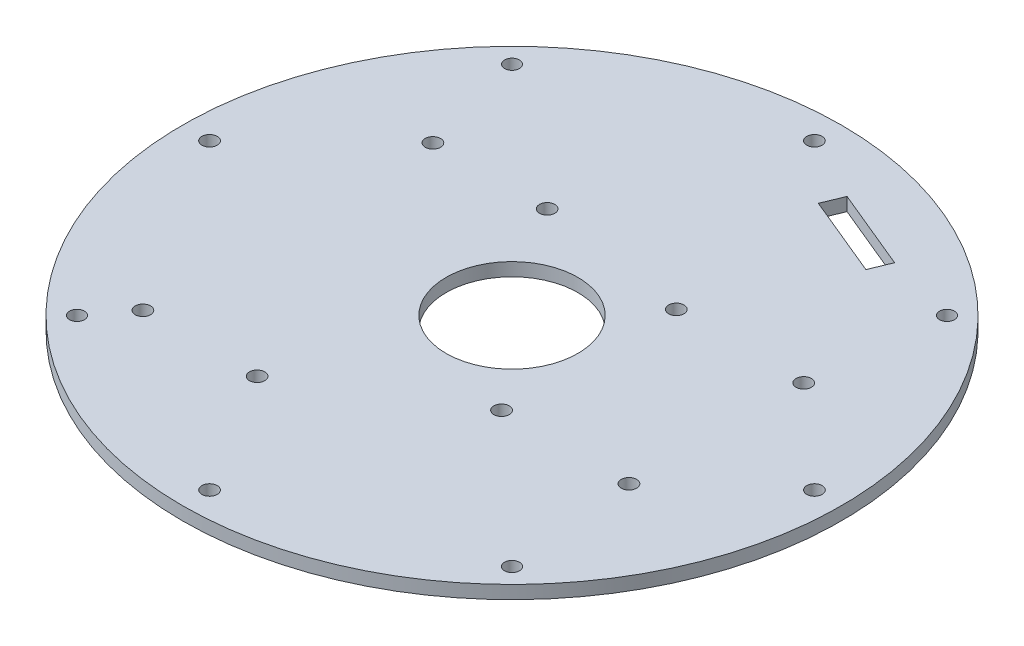
ISO-10303-21;
HEADER;
FILE_DESCRIPTION(('STEP AP214'),'2;1');
FILE_NAME('part.step','',(''),(''),'','','');
FILE_SCHEMA(('AUTOMOTIVE_DESIGN { 1 0 10303 214 1 1 1 1 }'));
ENDSEC;
DATA;
#1=APPLICATION_CONTEXT('core data for automotive mechanical design processes');
#2=APPLICATION_PROTOCOL_DEFINITION('international standard','automotive_design',2000,#1);
#3=PRODUCT_CONTEXT('',#1,'mechanical');
#4=PRODUCT('Part','Part','',(#3));
#5=PRODUCT_RELATED_PRODUCT_CATEGORY('part','',(#4));
#6=PRODUCT_DEFINITION_FORMATION('','',#4);
#7=PRODUCT_DEFINITION_CONTEXT('part definition',#1,'design');
#8=PRODUCT_DEFINITION('design','',#6,#7);
#9=PRODUCT_DEFINITION_SHAPE('','',#8);
#10=(LENGTH_UNIT() NAMED_UNIT(*) SI_UNIT(.MILLI.,.METRE.));
#11=(NAMED_UNIT(*) PLANE_ANGLE_UNIT() SI_UNIT($,.RADIAN.));
#12=(NAMED_UNIT(*) SI_UNIT($,.STERADIAN.) SOLID_ANGLE_UNIT());
#13=UNCERTAINTY_MEASURE_WITH_UNIT(LENGTH_MEASURE(1.E-05),#10,'distance_accuracy_value','');
#14=(GEOMETRIC_REPRESENTATION_CONTEXT(3) GLOBAL_UNCERTAINTY_ASSIGNED_CONTEXT((#13)) GLOBAL_UNIT_ASSIGNED_CONTEXT((#10,
#11,#12)) REPRESENTATION_CONTEXT('',''));
#15=CARTESIAN_POINT('',(0.,0.,0.));
#16=DIRECTION('',(0.,0.,1.));
#17=DIRECTION('',(1.,0.,0.));
#18=AXIS2_PLACEMENT_3D('',#15,#16,#17);
#19=CARTESIAN_POINT('',(0.,3.,0.));
#20=DIRECTION('',(0.,1.,0.));
#21=DIRECTION('',(0.,0.,1.));
#22=AXIS2_PLACEMENT_3D('',#19,#20,#21);
#23=PLANE('',#22);
#24=CARTESIAN_POINT('',(46.4944426533332,3.,19.8841311409812));
#25=DIRECTION('',(0.,1.,0.));
#26=DIRECTION('',(0.,0.,1.));
#27=AXIS2_PLACEMENT_3D('',#24,#25,#26);
#28=CIRCLE('',#27,1.75);
#29=CARTESIAN_POINT('',(46.4944426533332,3.,21.6341311409812));
#30=VERTEX_POINT('',#29);
#31=EDGE_CURVE('E133',#30,#30,#28,.T.);
#32=ORIENTED_EDGE('',*,*,#31,.F.);
#33=EDGE_LOOP('',(#32));
#34=FACE_BOUND('',#33,.T.);
#35=CARTESIAN_POINT('',(-43.,3.,41.));
#36=DIRECTION('',(0.,1.,0.));
#37=DIRECTION('',(0.,0.,1.));
#38=AXIS2_PLACEMENT_3D('',#35,#36,#37);
#39=CIRCLE('',#38,1.75);
#40=CARTESIAN_POINT('',(-43.,3.,42.75));
#41=VERTEX_POINT('',#40);
#42=EDGE_CURVE('E126',#41,#41,#39,.T.);
#43=ORIENTED_EDGE('',*,*,#42,.F.);
#44=EDGE_LOOP('',(#43));
#45=FACE_BOUND('',#44,.T.);
#46=CARTESIAN_POINT('',(-17.,3.,41.));
#47=DIRECTION('',(0.,1.,0.));
#48=DIRECTION('',(0.,0.,1.));
#49=AXIS2_PLACEMENT_3D('',#46,#47,#48);
#50=CIRCLE('',#49,1.75);
#51=CARTESIAN_POINT('',(-17.,3.,42.75));
#52=VERTEX_POINT('',#51);
#53=EDGE_CURVE('E145',#52,#52,#50,.T.);
#54=ORIENTED_EDGE('',*,*,#53,.F.);
#55=EDGE_LOOP('',(#54));
#56=FACE_BOUND('',#55,.T.);
#57=CARTESIAN_POINT('',(-17.,3.,-25.));
#58=DIRECTION('',(0.,1.,0.));
#59=DIRECTION('',(0.,0.,1.));
#60=AXIS2_PLACEMENT_3D('',#57,#58,#59);
#61=CIRCLE('',#60,1.75);
#62=CARTESIAN_POINT('',(-17.,3.,-23.25));
#63=VERTEX_POINT('',#62);
#64=EDGE_CURVE('E138',#63,#63,#61,.T.);
#65=ORIENTED_EDGE('',*,*,#64,.F.);
#66=EDGE_LOOP('',(#65));
#67=FACE_BOUND('',#66,.T.);
#68=DIRECTION('',(-0.923879532511288,0.,-0.382683432365086));
#69=VECTOR('',#68,1.);
#70=CARTESIAN_POINT('',(33.1565098479308,3.,-53.9156364583046));
#71=LINE('',#70,#69);
#72=CARTESIAN_POINT('',(33.1565098479308,3.,-53.9156364583046));
#73=VERTEX_POINT('',#72);
#74=CARTESIAN_POINT('',(14.678919197705,3.,-61.5693051056064));
#75=VERTEX_POINT('',#74);
#76=EDGE_CURVE('E82',#73,#75,#71,.T.);
#77=ORIENTED_EDGE('',*,*,#76,.F.);
#78=DIRECTION('',(0.382683432365087,0.,-0.923879532511288));
#79=VECTOR('',#78,1.);
#80=CARTESIAN_POINT('',(31.2430926861054,3.,-49.2962387957482));
#81=LINE('',#80,#79);
#82=CARTESIAN_POINT('',(31.2430926861054,3.,-49.2962387957482));
#83=VERTEX_POINT('',#82);
#84=EDGE_CURVE('E74',#83,#73,#81,.T.);
#85=ORIENTED_EDGE('',*,*,#84,.F.);
#86=DIRECTION('',(0.923879532511288,0.,0.382683432365086));
#87=VECTOR('',#86,1.);
#88=CARTESIAN_POINT('',(31.2430926861054,3.,-49.2962387957482));
#89=LINE('',#88,#87);
#90=CARTESIAN_POINT('',(12.7655020358796,3.,-56.9499074430499));
#91=VERTEX_POINT('',#90);
#92=EDGE_CURVE('E97',#91,#83,#89,.T.);
#93=ORIENTED_EDGE('',*,*,#92,.F.);
#94=DIRECTION('',(-0.382683432365086,0.,0.923879532511288));
#95=VECTOR('',#94,1.);
#96=CARTESIAN_POINT('',(12.7655020358796,3.,-56.9499074430499));
#97=LINE('',#96,#95);
#98=EDGE_CURVE('E95',#75,#91,#97,.T.);
#99=ORIENTED_EDGE('',*,*,#98,.F.);
#100=EDGE_LOOP('',(#77,#85,#93,#99));
#101=FACE_BOUND('',#100,.T.);
#102=CARTESIAN_POINT('',(17.5055573466668,3.,19.8841311409812));
#103=DIRECTION('',(0.,1.,0.));
#104=DIRECTION('',(0.,0.,1.));
#105=AXIS2_PLACEMENT_3D('',#102,#103,#104);
#106=CIRCLE('',#105,1.75);
#107=CARTESIAN_POINT('',(17.5055573466668,3.,21.6341311409812));
#108=VERTEX_POINT('',#107);
#109=EDGE_CURVE('E125',#108,#108,#106,.T.);
#110=ORIENTED_EDGE('',*,*,#109,.F.);
#111=EDGE_LOOP('',(#110));
#112=FACE_BOUND('',#111,.T.);
#113=CARTESIAN_POINT('',(46.4944426533332,3.,-19.8841311409812));
#114=DIRECTION('',(0.,1.,0.));
#115=DIRECTION('',(0.,0.,1.));
#116=AXIS2_PLACEMENT_3D('',#113,#114,#115);
#117=CIRCLE('',#116,1.75);
#118=CARTESIAN_POINT('',(46.4944426533332,3.,-18.1341311409812));
#119=VERTEX_POINT('',#118);
#120=EDGE_CURVE('E119',#119,#119,#117,.T.);
#121=ORIENTED_EDGE('',*,*,#120,.F.);
#122=EDGE_LOOP('',(#121));
#123=FACE_BOUND('',#122,.T.);
#124=CARTESIAN_POINT('',(17.5055573466668,3.,-19.8841311409812));
#125=DIRECTION('',(0.,1.,0.));
#126=DIRECTION('',(0.,0.,1.));
#127=AXIS2_PLACEMENT_3D('',#124,#125,#126);
#128=CIRCLE('',#127,1.74999999999999);
#129=CARTESIAN_POINT('',(17.5055573466668,3.,-18.1341311409812));
#130=VERTEX_POINT('',#129);
#131=EDGE_CURVE('E112',#130,#130,#128,.T.);
#132=ORIENTED_EDGE('',*,*,#131,.F.);
#133=EDGE_LOOP('',(#132));
#134=FACE_BOUND('',#133,.T.);
#135=CARTESIAN_POINT('',(-43.,3.,-25.));
#136=DIRECTION('',(0.,1.,0.));
#137=DIRECTION('',(0.,0.,1.));
#138=AXIS2_PLACEMENT_3D('',#135,#136,#137);
#139=CIRCLE('',#138,1.75);
#140=CARTESIAN_POINT('',(-43.,3.,-23.25));
#141=VERTEX_POINT('',#140);
#142=EDGE_CURVE('E150',#141,#141,#139,.T.);
#143=ORIENTED_EDGE('',*,*,#142,.F.);
#144=EDGE_LOOP('',(#143));
#145=FACE_BOUND('',#144,.T.);
#146=CARTESIAN_POINT('',(0.,3.,-68.825));
#147=DIRECTION('',(0.,1.,0.));
#148=DIRECTION('',(0.,0.,1.));
#149=AXIS2_PLACEMENT_3D('',#146,#147,#148);
#150=CIRCLE('',#149,1.75);
#151=CARTESIAN_POINT('',(0.,3.,-67.075));
#152=VERTEX_POINT('',#151);
#153=EDGE_CURVE('E156',#152,#152,#150,.T.);
#154=ORIENTED_EDGE('',*,*,#153,.F.);
#155=EDGE_LOOP('',(#154));
#156=FACE_BOUND('',#155,.T.);
#157=CARTESIAN_POINT('',(68.825,3.,0.));
#158=DIRECTION('',(0.,1.,0.));
#159=DIRECTION('',(0.,0.,1.));
#160=AXIS2_PLACEMENT_3D('',#157,#158,#159);
#161=CIRCLE('',#160,1.75);
#162=CARTESIAN_POINT('',(68.825,3.,1.75));
#163=VERTEX_POINT('',#162);
#164=EDGE_CURVE('E163',#163,#163,#161,.T.);
#165=ORIENTED_EDGE('',*,*,#164,.F.);
#166=EDGE_LOOP('',(#165));
#167=FACE_BOUND('',#166,.T.);
#168=CARTESIAN_POINT('',(0.,3.,68.825));
#169=DIRECTION('',(0.,1.,0.));
#170=DIRECTION('',(0.,0.,1.));
#171=AXIS2_PLACEMENT_3D('',#168,#169,#170);
#172=CIRCLE('',#171,1.75);
#173=CARTESIAN_POINT('',(0.,3.,70.575));
#174=VERTEX_POINT('',#173);
#175=EDGE_CURVE('E169',#174,#174,#172,.T.);
#176=ORIENTED_EDGE('',*,*,#175,.F.);
#177=EDGE_LOOP('',(#176));
#178=FACE_BOUND('',#177,.T.);
#179=CARTESIAN_POINT('',(-68.825,3.,0.));
#180=DIRECTION('',(0.,1.,0.));
#181=DIRECTION('',(0.,0.,1.));
#182=AXIS2_PLACEMENT_3D('',#179,#180,#181);
#183=CIRCLE('',#182,1.75);
#184=CARTESIAN_POINT('',(-68.825,3.,1.75));
#185=VERTEX_POINT('',#184);
#186=EDGE_CURVE('E175',#185,#185,#183,.T.);
#187=ORIENTED_EDGE('',*,*,#186,.F.);
#188=EDGE_LOOP('',(#187));
#189=FACE_BOUND('',#188,.T.);
#190=CARTESIAN_POINT('',(49.4974746830584,3.,49.4974746830582));
#191=DIRECTION('',(0.,1.,0.));
#192=DIRECTION('',(0.,0.,1.));
#193=AXIS2_PLACEMENT_3D('',#190,#191,#192);
#194=CIRCLE('',#193,1.7);
#195=CARTESIAN_POINT('',(49.4974746830584,3.,51.1974746830582));
#196=VERTEX_POINT('',#195);
#197=EDGE_CURVE('E186',#196,#196,#194,.T.);
#198=ORIENTED_EDGE('',*,*,#197,.F.);
#199=EDGE_LOOP('',(#198));
#200=FACE_BOUND('',#199,.T.);
#201=CARTESIAN_POINT('',(-49.4974746830584,3.,-49.4974746830582));
#202=DIRECTION('',(0.,1.,0.));
#203=DIRECTION('',(0.,0.,1.));
#204=AXIS2_PLACEMENT_3D('',#201,#202,#203);
#205=CIRCLE('',#204,1.7);
#206=CARTESIAN_POINT('',(-49.4974746830584,3.,-47.7974746830582));
#207=VERTEX_POINT('',#206);
#208=EDGE_CURVE('E198',#207,#207,#205,.T.);
#209=ORIENTED_EDGE('',*,*,#208,.F.);
#210=EDGE_LOOP('',(#209));
#211=FACE_BOUND('',#210,.T.);
#212=CARTESIAN_POINT('',(0.,3.,0.));
#213=DIRECTION('',(0.,1.,0.));
#214=DIRECTION('',(0.,0.,1.));
#215=AXIS2_PLACEMENT_3D('',#212,#213,#214);
#216=CIRCLE('',#215,75.);
#217=CARTESIAN_POINT('',(0.,3.,75.));
#218=VERTEX_POINT('',#217);
#219=EDGE_CURVE('E11',#218,#218,#216,.T.);
#220=ORIENTED_EDGE('',*,*,#219,.T.);
#221=EDGE_LOOP('',(#220));
#222=FACE_BOUND('',#221,.T.);
#223=CARTESIAN_POINT('',(49.4974746830582,3.,-49.4974746830584));
#224=DIRECTION('',(0.,1.,0.));
#225=DIRECTION('',(0.,0.,1.));
#226=AXIS2_PLACEMENT_3D('',#223,#224,#225);
#227=CIRCLE('',#226,1.7);
#228=CARTESIAN_POINT('',(49.4974746830582,3.,-47.7974746830584));
#229=VERTEX_POINT('',#228);
#230=EDGE_CURVE('E204',#229,#229,#227,.T.);
#231=ORIENTED_EDGE('',*,*,#230,.F.);
#232=EDGE_LOOP('',(#231));
#233=FACE_BOUND('',#232,.T.);
#234=CARTESIAN_POINT('',(-49.4974746830582,3.,49.4974746830584));
#235=DIRECTION('',(0.,1.,0.));
#236=DIRECTION('',(0.,0.,1.));
#237=AXIS2_PLACEMENT_3D('',#234,#235,#236);
#238=CIRCLE('',#237,1.7);
#239=CARTESIAN_POINT('',(-49.4974746830582,3.,51.1974746830584));
#240=VERTEX_POINT('',#239);
#241=EDGE_CURVE('E192',#240,#240,#238,.T.);
#242=ORIENTED_EDGE('',*,*,#241,.F.);
#243=EDGE_LOOP('',(#242));
#244=FACE_BOUND('',#243,.T.);
#245=CARTESIAN_POINT('',(0.,3.,0.));
#246=DIRECTION('',(0.,1.,0.));
#247=DIRECTION('',(0.,0.,1.));
#248=AXIS2_PLACEMENT_3D('',#245,#246,#247);
#249=CIRCLE('',#248,15.);
#250=CARTESIAN_POINT('',(0.,3.,15.));
#251=VERTEX_POINT('',#250);
#252=EDGE_CURVE('E180',#251,#251,#249,.T.);
#253=ORIENTED_EDGE('',*,*,#252,.F.);
#254=EDGE_LOOP('',(#253));
#255=FACE_BOUND('',#254,.T.);
#256=ADVANCED_FACE('F33',(#34,#45,#56,#67,#101,#112,#123,#134,#145,#156,#167,#178,#189,#200,
#211,#222,#233,#244,#255),#23,.T.);
#257=CARTESIAN_POINT('',(0.,0.,0.));
#258=DIRECTION('',(0.,1.,0.));
#259=DIRECTION('',(0.,0.,1.));
#260=AXIS2_PLACEMENT_3D('',#257,#258,#259);
#261=PLANE('',#260);
#262=CARTESIAN_POINT('',(46.4944426533332,0.,19.8841311409812));
#263=DIRECTION('',(0.,1.,0.));
#264=DIRECTION('',(0.,0.,1.));
#265=AXIS2_PLACEMENT_3D('',#262,#263,#264);
#266=CIRCLE('',#265,1.75);
#267=CARTESIAN_POINT('',(46.4944426533332,0.,21.6341311409812));
#268=VERTEX_POINT('',#267);
#269=EDGE_CURVE('E115',#268,#268,#266,.T.);
#270=ORIENTED_EDGE('',*,*,#269,.T.);
#271=EDGE_LOOP('',(#270));
#272=FACE_BOUND('',#271,.T.);
#273=CARTESIAN_POINT('',(-43.,0.,41.));
#274=DIRECTION('',(0.,1.,0.));
#275=DIRECTION('',(0.,0.,1.));
#276=AXIS2_PLACEMENT_3D('',#273,#274,#275);
#277=CIRCLE('',#276,1.75);
#278=CARTESIAN_POINT('',(-43.,0.,42.75));
#279=VERTEX_POINT('',#278);
#280=EDGE_CURVE('E130',#279,#279,#277,.T.);
#281=ORIENTED_EDGE('',*,*,#280,.T.);
#282=EDGE_LOOP('',(#281));
#283=FACE_BOUND('',#282,.T.);
#284=CARTESIAN_POINT('',(-17.,0.,41.));
#285=DIRECTION('',(0.,1.,0.));
#286=DIRECTION('',(0.,0.,1.));
#287=AXIS2_PLACEMENT_3D('',#284,#285,#286);
#288=CIRCLE('',#287,1.75);
#289=CARTESIAN_POINT('',(-17.,0.,42.75));
#290=VERTEX_POINT('',#289);
#291=EDGE_CURVE('E129',#290,#290,#288,.T.);
#292=ORIENTED_EDGE('',*,*,#291,.T.);
#293=EDGE_LOOP('',(#292));
#294=FACE_BOUND('',#293,.T.);
#295=CARTESIAN_POINT('',(-17.,0.,-25.));
#296=DIRECTION('',(0.,1.,0.));
#297=DIRECTION('',(0.,0.,1.));
#298=AXIS2_PLACEMENT_3D('',#295,#296,#297);
#299=CIRCLE('',#298,1.75);
#300=CARTESIAN_POINT('',(-17.,0.,-23.25));
#301=VERTEX_POINT('',#300);
#302=EDGE_CURVE('E142',#301,#301,#299,.T.);
#303=ORIENTED_EDGE('',*,*,#302,.T.);
#304=EDGE_LOOP('',(#303));
#305=FACE_BOUND('',#304,.T.);
#306=DIRECTION('',(0.382683432365087,0.,-0.923879532511288));
#307=VECTOR('',#306,1.);
#308=CARTESIAN_POINT('',(31.2430926861054,0.,-49.2962387957482));
#309=LINE('',#308,#307);
#310=CARTESIAN_POINT('',(31.2430926861054,0.,-49.2962387957482));
#311=VERTEX_POINT('',#310);
#312=CARTESIAN_POINT('',(33.1565098479308,0.,-53.9156364583046));
#313=VERTEX_POINT('',#312);
#314=EDGE_CURVE('E56',#311,#313,#309,.T.);
#315=ORIENTED_EDGE('',*,*,#314,.T.);
#316=DIRECTION('',(-0.923879532511288,0.,-0.382683432365086));
#317=VECTOR('',#316,1.);
#318=CARTESIAN_POINT('',(33.1565098479308,0.,-53.9156364583046));
#319=LINE('',#318,#317);
#320=CARTESIAN_POINT('',(14.678919197705,0.,-61.5693051056064));
#321=VERTEX_POINT('',#320);
#322=EDGE_CURVE('E89',#313,#321,#319,.T.);
#323=ORIENTED_EDGE('',*,*,#322,.T.);
#324=DIRECTION('',(-0.382683432365086,0.,0.923879532511288));
#325=VECTOR('',#324,1.);
#326=CARTESIAN_POINT('',(12.7655020358796,0.,-56.9499074430499));
#327=LINE('',#326,#325);
#328=CARTESIAN_POINT('',(12.7655020358796,0.,-56.9499074430499));
#329=VERTEX_POINT('',#328);
#330=EDGE_CURVE('E104',#321,#329,#327,.T.);
#331=ORIENTED_EDGE('',*,*,#330,.T.);
#332=DIRECTION('',(0.923879532511288,0.,0.382683432365086));
#333=VECTOR('',#332,1.);
#334=CARTESIAN_POINT('',(31.2430926861054,0.,-49.2962387957482));
#335=LINE('',#334,#333);
#336=EDGE_CURVE('E83',#329,#311,#335,.T.);
#337=ORIENTED_EDGE('',*,*,#336,.T.);
#338=EDGE_LOOP('',(#315,#323,#331,#337));
#339=FACE_BOUND('',#338,.T.);
#340=CARTESIAN_POINT('',(17.5055573466668,0.,19.8841311409812));
#341=DIRECTION('',(0.,1.,0.));
#342=DIRECTION('',(0.,0.,1.));
#343=AXIS2_PLACEMENT_3D('',#340,#341,#342);
#344=CIRCLE('',#343,1.75);
#345=CARTESIAN_POINT('',(17.5055573466668,0.,21.6341311409812));
#346=VERTEX_POINT('',#345);
#347=EDGE_CURVE('E90',#346,#346,#344,.T.);
#348=ORIENTED_EDGE('',*,*,#347,.T.);
#349=EDGE_LOOP('',(#348));
#350=FACE_BOUND('',#349,.T.);
#351=CARTESIAN_POINT('',(46.4944426533332,0.,-19.8841311409812));
#352=DIRECTION('',(0.,1.,0.));
#353=DIRECTION('',(0.,0.,1.));
#354=AXIS2_PLACEMENT_3D('',#351,#352,#353);
#355=CIRCLE('',#354,1.75);
#356=CARTESIAN_POINT('',(46.4944426533332,0.,-18.1341311409812));
#357=VERTEX_POINT('',#356);
#358=EDGE_CURVE('E122',#357,#357,#355,.T.);
#359=ORIENTED_EDGE('',*,*,#358,.T.);
#360=EDGE_LOOP('',(#359));
#361=FACE_BOUND('',#360,.T.);
#362=CARTESIAN_POINT('',(17.5055573466668,0.,-19.8841311409812));
#363=DIRECTION('',(0.,1.,0.));
#364=DIRECTION('',(0.,0.,1.));
#365=AXIS2_PLACEMENT_3D('',#362,#363,#364);
#366=CIRCLE('',#365,1.74999999999999);
#367=CARTESIAN_POINT('',(17.5055573466668,0.,-18.1341311409812));
#368=VERTEX_POINT('',#367);
#369=EDGE_CURVE('E116',#368,#368,#366,.T.);
#370=ORIENTED_EDGE('',*,*,#369,.T.);
#371=EDGE_LOOP('',(#370));
#372=FACE_BOUND('',#371,.T.);
#373=CARTESIAN_POINT('',(-43.,0.,-25.));
#374=DIRECTION('',(0.,1.,0.));
#375=DIRECTION('',(0.,0.,1.));
#376=AXIS2_PLACEMENT_3D('',#373,#374,#375);
#377=CIRCLE('',#376,1.75);
#378=CARTESIAN_POINT('',(-43.,0.,-23.25));
#379=VERTEX_POINT('',#378);
#380=EDGE_CURVE('E141',#379,#379,#377,.T.);
#381=ORIENTED_EDGE('',*,*,#380,.T.);
#382=EDGE_LOOP('',(#381));
#383=FACE_BOUND('',#382,.T.);
#384=CARTESIAN_POINT('',(0.,0.,-68.825));
#385=DIRECTION('',(0.,1.,0.));
#386=DIRECTION('',(0.,0.,1.));
#387=AXIS2_PLACEMENT_3D('',#384,#385,#386);
#388=CIRCLE('',#387,1.75);
#389=CARTESIAN_POINT('',(0.,0.,-67.075));
#390=VERTEX_POINT('',#389);
#391=EDGE_CURVE('E160',#390,#390,#388,.T.);
#392=ORIENTED_EDGE('',*,*,#391,.T.);
#393=EDGE_LOOP('',(#392));
#394=FACE_BOUND('',#393,.T.);
#395=CARTESIAN_POINT('',(68.825,0.,0.));
#396=DIRECTION('',(0.,1.,0.));
#397=DIRECTION('',(0.,0.,1.));
#398=AXIS2_PLACEMENT_3D('',#395,#396,#397);
#399=CIRCLE('',#398,1.75);
#400=CARTESIAN_POINT('',(68.825,0.,1.75));
#401=VERTEX_POINT('',#400);
#402=EDGE_CURVE('E166',#401,#401,#399,.T.);
#403=ORIENTED_EDGE('',*,*,#402,.T.);
#404=EDGE_LOOP('',(#403));
#405=FACE_BOUND('',#404,.T.);
#406=CARTESIAN_POINT('',(0.,0.,68.825));
#407=DIRECTION('',(0.,1.,0.));
#408=DIRECTION('',(0.,0.,1.));
#409=AXIS2_PLACEMENT_3D('',#406,#407,#408);
#410=CIRCLE('',#409,1.75);
#411=CARTESIAN_POINT('',(0.,0.,70.575));
#412=VERTEX_POINT('',#411);
#413=EDGE_CURVE('E172',#412,#412,#410,.T.);
#414=ORIENTED_EDGE('',*,*,#413,.T.);
#415=EDGE_LOOP('',(#414));
#416=FACE_BOUND('',#415,.T.);
#417=CARTESIAN_POINT('',(-68.825,0.,0.));
#418=DIRECTION('',(0.,1.,0.));
#419=DIRECTION('',(0.,0.,1.));
#420=AXIS2_PLACEMENT_3D('',#417,#418,#419);
#421=CIRCLE('',#420,1.75);
#422=CARTESIAN_POINT('',(-68.825,0.,1.75));
#423=VERTEX_POINT('',#422);
#424=EDGE_CURVE('E153',#423,#423,#421,.T.);
#425=ORIENTED_EDGE('',*,*,#424,.T.);
#426=EDGE_LOOP('',(#425));
#427=FACE_BOUND('',#426,.T.);
#428=CARTESIAN_POINT('',(0.,0.,0.));
#429=DIRECTION('',(0.,1.,0.));
#430=DIRECTION('',(0.,0.,1.));
#431=AXIS2_PLACEMENT_3D('',#428,#429,#430);
#432=CIRCLE('',#431,75.);
#433=CARTESIAN_POINT('',(0.,0.,75.));
#434=VERTEX_POINT('',#433);
#435=EDGE_CURVE('E37',#434,#434,#432,.T.);
#436=ORIENTED_EDGE('',*,*,#435,.F.);
#437=EDGE_LOOP('',(#436));
#438=FACE_BOUND('',#437,.T.);
#439=CARTESIAN_POINT('',(49.4974746830582,0.,-49.4974746830584));
#440=DIRECTION('',(0.,1.,0.));
#441=DIRECTION('',(0.,0.,1.));
#442=AXIS2_PLACEMENT_3D('',#439,#440,#441);
#443=CIRCLE('',#442,1.7);
#444=CARTESIAN_POINT('',(49.4974746830582,0.,-47.7974746830584));
#445=VERTEX_POINT('',#444);
#446=EDGE_CURVE('E201',#445,#445,#443,.T.);
#447=ORIENTED_EDGE('',*,*,#446,.T.);
#448=EDGE_LOOP('',(#447));
#449=FACE_BOUND('',#448,.T.);
#450=CARTESIAN_POINT('',(-49.4974746830584,0.,-49.4974746830582));
#451=DIRECTION('',(0.,1.,0.));
#452=DIRECTION('',(0.,0.,1.));
#453=AXIS2_PLACEMENT_3D('',#450,#451,#452);
#454=CIRCLE('',#453,1.7);
#455=CARTESIAN_POINT('',(-49.4974746830584,0.,-47.7974746830582));
#456=VERTEX_POINT('',#455);
#457=EDGE_CURVE('E195',#456,#456,#454,.T.);
#458=ORIENTED_EDGE('',*,*,#457,.T.);
#459=EDGE_LOOP('',(#458));
#460=FACE_BOUND('',#459,.T.);
#461=CARTESIAN_POINT('',(-49.4974746830582,0.,49.4974746830584));
#462=DIRECTION('',(0.,1.,0.));
#463=DIRECTION('',(0.,0.,1.));
#464=AXIS2_PLACEMENT_3D('',#461,#462,#463);
#465=CIRCLE('',#464,1.7);
#466=CARTESIAN_POINT('',(-49.4974746830582,0.,51.1974746830584));
#467=VERTEX_POINT('',#466);
#468=EDGE_CURVE('E189',#467,#467,#465,.T.);
#469=ORIENTED_EDGE('',*,*,#468,.T.);
#470=EDGE_LOOP('',(#469));
#471=FACE_BOUND('',#470,.T.);
#472=CARTESIAN_POINT('',(49.4974746830584,0.,49.4974746830582));
#473=DIRECTION('',(0.,1.,0.));
#474=DIRECTION('',(0.,0.,1.));
#475=AXIS2_PLACEMENT_3D('',#472,#473,#474);
#476=CIRCLE('',#475,1.7);
#477=CARTESIAN_POINT('',(49.4974746830584,0.,51.1974746830582));
#478=VERTEX_POINT('',#477);
#479=EDGE_CURVE('E183',#478,#478,#476,.T.);
#480=ORIENTED_EDGE('',*,*,#479,.T.);
#481=EDGE_LOOP('',(#480));
#482=FACE_BOUND('',#481,.T.);
#483=CARTESIAN_POINT('',(0.,0.,0.));
#484=DIRECTION('',(0.,1.,0.));
#485=DIRECTION('',(0.,0.,1.));
#486=AXIS2_PLACEMENT_3D('',#483,#484,#485);
#487=CIRCLE('',#486,15.);
#488=CARTESIAN_POINT('',(0.,0.,15.));
#489=VERTEX_POINT('',#488);
#490=EDGE_CURVE('E159',#489,#489,#487,.T.);
#491=ORIENTED_EDGE('',*,*,#490,.T.);
#492=EDGE_LOOP('',(#491));
#493=FACE_BOUND('',#492,.T.);
#494=ADVANCED_FACE('F210',(#272,#283,#294,#305,#339,#350,#361,#372,#383,#394,#405,#416,#427,
#438,#449,#460,#471,#482,#493),#261,.F.);
#495=CARTESIAN_POINT('',(0.,3.,0.));
#496=DIRECTION('',(0.,-1.,0.));
#497=DIRECTION('',(0.,0.,-1.));
#498=AXIS2_PLACEMENT_3D('',#495,#496,#497);
#499=CYLINDRICAL_SURFACE('',#498,75.);
#500=ORIENTED_EDGE('',*,*,#219,.F.);
#501=EDGE_LOOP('',(#500));
#502=FACE_BOUND('',#501,.T.);
#503=ORIENTED_EDGE('',*,*,#435,.T.);
#504=EDGE_LOOP('',(#503));
#505=FACE_BOUND('',#504,.T.);
#506=ADVANCED_FACE('F35',(#502,#505),#499,.T.);
#507=CARTESIAN_POINT('',(49.4974746830582,3.,-49.4974746830584));
#508=DIRECTION('',(0.,-1.,0.));
#509=DIRECTION('',(0.,0.,-1.));
#510=AXIS2_PLACEMENT_3D('',#507,#508,#509);
#511=CYLINDRICAL_SURFACE('',#510,1.7);
#512=ORIENTED_EDGE('',*,*,#230,.T.);
#513=EDGE_LOOP('',(#512));
#514=FACE_BOUND('',#513,.T.);
#515=ORIENTED_EDGE('',*,*,#446,.F.);
#516=EDGE_LOOP('',(#515));
#517=FACE_BOUND('',#516,.T.);
#518=ADVANCED_FACE('F213',(#514,#517),#511,.F.);
#519=CARTESIAN_POINT('',(-49.4974746830584,3.,-49.4974746830582));
#520=DIRECTION('',(0.,-1.,0.));
#521=DIRECTION('',(0.,0.,-1.));
#522=AXIS2_PLACEMENT_3D('',#519,#520,#521);
#523=CYLINDRICAL_SURFACE('',#522,1.7);
#524=ORIENTED_EDGE('',*,*,#208,.T.);
#525=EDGE_LOOP('',(#524));
#526=FACE_BOUND('',#525,.T.);
#527=ORIENTED_EDGE('',*,*,#457,.F.);
#528=EDGE_LOOP('',(#527));
#529=FACE_BOUND('',#528,.T.);
#530=ADVANCED_FACE('F215',(#526,#529),#523,.F.);
#531=CARTESIAN_POINT('',(-49.4974746830582,3.,49.4974746830584));
#532=DIRECTION('',(0.,-1.,0.));
#533=DIRECTION('',(0.,0.,-1.));
#534=AXIS2_PLACEMENT_3D('',#531,#532,#533);
#535=CYLINDRICAL_SURFACE('',#534,1.7);
#536=ORIENTED_EDGE('',*,*,#241,.T.);
#537=EDGE_LOOP('',(#536));
#538=FACE_BOUND('',#537,.T.);
#539=ORIENTED_EDGE('',*,*,#468,.F.);
#540=EDGE_LOOP('',(#539));
#541=FACE_BOUND('',#540,.T.);
#542=ADVANCED_FACE('F222',(#538,#541),#535,.F.);
#543=CARTESIAN_POINT('',(49.4974746830584,3.,49.4974746830582));
#544=DIRECTION('',(0.,-1.,0.));
#545=DIRECTION('',(0.,0.,-1.));
#546=AXIS2_PLACEMENT_3D('',#543,#544,#545);
#547=CYLINDRICAL_SURFACE('',#546,1.7);
#548=ORIENTED_EDGE('',*,*,#197,.T.);
#549=EDGE_LOOP('',(#548));
#550=FACE_BOUND('',#549,.T.);
#551=ORIENTED_EDGE('',*,*,#479,.F.);
#552=EDGE_LOOP('',(#551));
#553=FACE_BOUND('',#552,.T.);
#554=ADVANCED_FACE('F285',(#550,#553),#547,.F.);
#555=CARTESIAN_POINT('',(0.,3.,0.));
#556=DIRECTION('',(0.,-1.,0.));
#557=DIRECTION('',(0.,0.,-1.));
#558=AXIS2_PLACEMENT_3D('',#555,#556,#557);
#559=CYLINDRICAL_SURFACE('',#558,15.);
#560=ORIENTED_EDGE('',*,*,#252,.T.);
#561=EDGE_LOOP('',(#560));
#562=FACE_BOUND('',#561,.T.);
#563=ORIENTED_EDGE('',*,*,#490,.F.);
#564=EDGE_LOOP('',(#563));
#565=FACE_BOUND('',#564,.T.);
#566=ADVANCED_FACE('F275',(#562,#565),#559,.F.);
#567=CARTESIAN_POINT('',(-68.825,3.,0.));
#568=DIRECTION('',(0.,-1.,0.));
#569=DIRECTION('',(0.,0.,-1.));
#570=AXIS2_PLACEMENT_3D('',#567,#568,#569);
#571=CYLINDRICAL_SURFACE('',#570,1.75);
#572=ORIENTED_EDGE('',*,*,#186,.T.);
#573=EDGE_LOOP('',(#572));
#574=FACE_BOUND('',#573,.T.);
#575=ORIENTED_EDGE('',*,*,#424,.F.);
#576=EDGE_LOOP('',(#575));
#577=FACE_BOUND('',#576,.T.);
#578=ADVANCED_FACE('F272',(#574,#577),#571,.F.);
#579=CARTESIAN_POINT('',(0.,3.,68.825));
#580=DIRECTION('',(0.,-1.,0.));
#581=DIRECTION('',(0.,0.,-1.));
#582=AXIS2_PLACEMENT_3D('',#579,#580,#581);
#583=CYLINDRICAL_SURFACE('',#582,1.75);
#584=ORIENTED_EDGE('',*,*,#175,.T.);
#585=EDGE_LOOP('',(#584));
#586=FACE_BOUND('',#585,.T.);
#587=ORIENTED_EDGE('',*,*,#413,.F.);
#588=EDGE_LOOP('',(#587));
#589=FACE_BOUND('',#588,.T.);
#590=ADVANCED_FACE('F274',(#586,#589),#583,.F.);
#591=CARTESIAN_POINT('',(68.825,3.,0.));
#592=DIRECTION('',(0.,-1.,0.));
#593=DIRECTION('',(0.,0.,-1.));
#594=AXIS2_PLACEMENT_3D('',#591,#592,#593);
#595=CYLINDRICAL_SURFACE('',#594,1.75);
#596=ORIENTED_EDGE('',*,*,#164,.T.);
#597=EDGE_LOOP('',(#596));
#598=FACE_BOUND('',#597,.T.);
#599=ORIENTED_EDGE('',*,*,#402,.F.);
#600=EDGE_LOOP('',(#599));
#601=FACE_BOUND('',#600,.T.);
#602=ADVANCED_FACE('F282',(#598,#601),#595,.F.);
#603=CARTESIAN_POINT('',(0.,3.,-68.825));
#604=DIRECTION('',(0.,-1.,0.));
#605=DIRECTION('',(0.,0.,-1.));
#606=AXIS2_PLACEMENT_3D('',#603,#604,#605);
#607=CYLINDRICAL_SURFACE('',#606,1.75);
#608=ORIENTED_EDGE('',*,*,#153,.T.);
#609=EDGE_LOOP('',(#608));
#610=FACE_BOUND('',#609,.T.);
#611=ORIENTED_EDGE('',*,*,#391,.F.);
#612=EDGE_LOOP('',(#611));
#613=FACE_BOUND('',#612,.T.);
#614=ADVANCED_FACE('F339',(#610,#613),#607,.F.);
#615=CARTESIAN_POINT('',(-43.,3.,-25.));
#616=DIRECTION('',(0.,-1.,0.));
#617=DIRECTION('',(0.,0.,-1.));
#618=AXIS2_PLACEMENT_3D('',#615,#616,#617);
#619=CYLINDRICAL_SURFACE('',#618,1.75);
#620=ORIENTED_EDGE('',*,*,#142,.T.);
#621=EDGE_LOOP('',(#620));
#622=FACE_BOUND('',#621,.T.);
#623=ORIENTED_EDGE('',*,*,#380,.F.);
#624=EDGE_LOOP('',(#623));
#625=FACE_BOUND('',#624,.T.);
#626=ADVANCED_FACE('F347',(#622,#625),#619,.F.);
#627=CARTESIAN_POINT('',(17.5055573466668,3.,-19.8841311409812));
#628=DIRECTION('',(0.,-1.,0.));
#629=DIRECTION('',(0.,0.,-1.));
#630=AXIS2_PLACEMENT_3D('',#627,#628,#629);
#631=CYLINDRICAL_SURFACE('',#630,1.74999999999999);
#632=ORIENTED_EDGE('',*,*,#131,.T.);
#633=EDGE_LOOP('',(#632));
#634=FACE_BOUND('',#633,.T.);
#635=ORIENTED_EDGE('',*,*,#369,.F.);
#636=EDGE_LOOP('',(#635));
#637=FACE_BOUND('',#636,.T.);
#638=ADVANCED_FACE('F369',(#634,#637),#631,.F.);
#639=CARTESIAN_POINT('',(46.4944426533332,3.,-19.8841311409812));
#640=DIRECTION('',(0.,-1.,0.));
#641=DIRECTION('',(0.,0.,-1.));
#642=AXIS2_PLACEMENT_3D('',#639,#640,#641);
#643=CYLINDRICAL_SURFACE('',#642,1.75);
#644=ORIENTED_EDGE('',*,*,#120,.T.);
#645=EDGE_LOOP('',(#644));
#646=FACE_BOUND('',#645,.T.);
#647=ORIENTED_EDGE('',*,*,#358,.F.);
#648=EDGE_LOOP('',(#647));
#649=FACE_BOUND('',#648,.T.);
#650=ADVANCED_FACE('F379',(#646,#649),#643,.F.);
#651=CARTESIAN_POINT('',(17.5055573466668,3.,19.8841311409812));
#652=DIRECTION('',(0.,-1.,0.));
#653=DIRECTION('',(0.,0.,-1.));
#654=AXIS2_PLACEMENT_3D('',#651,#652,#653);
#655=CYLINDRICAL_SURFACE('',#654,1.75);
#656=ORIENTED_EDGE('',*,*,#109,.T.);
#657=EDGE_LOOP('',(#656));
#658=FACE_BOUND('',#657,.T.);
#659=ORIENTED_EDGE('',*,*,#347,.F.);
#660=EDGE_LOOP('',(#659));
#661=FACE_BOUND('',#660,.T.);
#662=ADVANCED_FACE('F389',(#658,#661),#655,.F.);
#663=CARTESIAN_POINT('',(31.2430926861054,3.,-49.2962387957482));
#664=DIRECTION('',(-0.923879532511288,0.,-0.382683432365087));
#665=DIRECTION('',(-0.382683432365087,0.,0.923879532511288));
#666=AXIS2_PLACEMENT_3D('',#663,#664,#665);
#667=PLANE('',#666);
#668=ORIENTED_EDGE('',*,*,#314,.F.);
#669=DIRECTION('',(0.,-1.,0.));
#670=VECTOR('',#669,1.);
#671=CARTESIAN_POINT('',(31.2430926861054,3.,-49.2962387957482));
#672=LINE('',#671,#670);
#673=EDGE_CURVE('E78',#83,#311,#672,.T.);
#674=ORIENTED_EDGE('',*,*,#673,.F.);
#675=ORIENTED_EDGE('',*,*,#84,.T.);
#676=DIRECTION('',(0.,-1.,0.));
#677=VECTOR('',#676,1.);
#678=CARTESIAN_POINT('',(33.1565098479308,3.,-53.9156364583046));
#679=LINE('',#678,#677);
#680=EDGE_CURVE('E77',#73,#313,#679,.T.);
#681=ORIENTED_EDGE('',*,*,#680,.T.);
#682=EDGE_LOOP('',(#668,#674,#675,#681));
#683=FACE_BOUND('',#682,.T.);
#684=ADVANCED_FACE('F76',(#683),#667,.T.);
#685=CARTESIAN_POINT('',(33.1565098479308,3.,-53.9156364583046));
#686=DIRECTION('',(-0.382683432365086,0.,0.923879532511288));
#687=DIRECTION('',(0.923879532511288,0.,0.382683432365086));
#688=AXIS2_PLACEMENT_3D('',#685,#686,#687);
#689=PLANE('',#688);
#690=ORIENTED_EDGE('',*,*,#322,.F.);
#691=ORIENTED_EDGE('',*,*,#680,.F.);
#692=ORIENTED_EDGE('',*,*,#76,.T.);
#693=DIRECTION('',(0.,-1.,0.));
#694=VECTOR('',#693,1.);
#695=CARTESIAN_POINT('',(14.678919197705,3.,-61.5693051056064));
#696=LINE('',#695,#694);
#697=EDGE_CURVE('E91',#75,#321,#696,.T.);
#698=ORIENTED_EDGE('',*,*,#697,.T.);
#699=EDGE_LOOP('',(#690,#691,#692,#698));
#700=FACE_BOUND('',#699,.T.);
#701=ADVANCED_FACE('F86',(#700),#689,.T.);
#702=CARTESIAN_POINT('',(12.7655020358796,3.,-56.9499074430499));
#703=DIRECTION('',(0.923879532511288,0.,0.382683432365086));
#704=DIRECTION('',(0.382683432365086,0.,-0.923879532511288));
#705=AXIS2_PLACEMENT_3D('',#702,#703,#704);
#706=PLANE('',#705);
#707=ORIENTED_EDGE('',*,*,#330,.F.);
#708=ORIENTED_EDGE('',*,*,#697,.F.);
#709=ORIENTED_EDGE('',*,*,#98,.T.);
#710=DIRECTION('',(0.,-1.,0.));
#711=VECTOR('',#710,1.);
#712=CARTESIAN_POINT('',(12.7655020358796,3.,-56.9499074430499));
#713=LINE('',#712,#711);
#714=EDGE_CURVE('E48',#91,#329,#713,.T.);
#715=ORIENTED_EDGE('',*,*,#714,.T.);
#716=EDGE_LOOP('',(#707,#708,#709,#715));
#717=FACE_BOUND('',#716,.T.);
#718=ADVANCED_FACE('F416',(#717),#706,.T.);
#719=CARTESIAN_POINT('',(31.2430926861054,3.,-49.2962387957482));
#720=DIRECTION('',(0.382683432365086,0.,-0.923879532511288));
#721=DIRECTION('',(-0.923879532511288,0.,-0.382683432365086));
#722=AXIS2_PLACEMENT_3D('',#719,#720,#721);
#723=PLANE('',#722);
#724=ORIENTED_EDGE('',*,*,#336,.F.);
#725=ORIENTED_EDGE('',*,*,#714,.F.);
#726=ORIENTED_EDGE('',*,*,#92,.T.);
#727=ORIENTED_EDGE('',*,*,#673,.T.);
#728=EDGE_LOOP('',(#724,#725,#726,#727));
#729=FACE_BOUND('',#728,.T.);
#730=ADVANCED_FACE('F245',(#729),#723,.T.);
#731=CARTESIAN_POINT('',(-17.,3.,-25.));
#732=DIRECTION('',(0.,-1.,0.));
#733=DIRECTION('',(0.,0.,-1.));
#734=AXIS2_PLACEMENT_3D('',#731,#732,#733);
#735=CYLINDRICAL_SURFACE('',#734,1.75);
#736=ORIENTED_EDGE('',*,*,#64,.T.);
#737=EDGE_LOOP('',(#736));
#738=FACE_BOUND('',#737,.T.);
#739=ORIENTED_EDGE('',*,*,#302,.F.);
#740=EDGE_LOOP('',(#739));
#741=FACE_BOUND('',#740,.T.);
#742=ADVANCED_FACE('F241',(#738,#741),#735,.F.);
#743=CARTESIAN_POINT('',(-17.,3.,41.));
#744=DIRECTION('',(0.,-1.,0.));
#745=DIRECTION('',(0.,0.,-1.));
#746=AXIS2_PLACEMENT_3D('',#743,#744,#745);
#747=CYLINDRICAL_SURFACE('',#746,1.75);
#748=ORIENTED_EDGE('',*,*,#53,.T.);
#749=EDGE_LOOP('',(#748));
#750=FACE_BOUND('',#749,.T.);
#751=ORIENTED_EDGE('',*,*,#291,.F.);
#752=EDGE_LOOP('',(#751));
#753=FACE_BOUND('',#752,.T.);
#754=ADVANCED_FACE('F244',(#750,#753),#747,.F.);
#755=CARTESIAN_POINT('',(-43.,3.,41.));
#756=DIRECTION('',(0.,-1.,0.));
#757=DIRECTION('',(0.,0.,-1.));
#758=AXIS2_PLACEMENT_3D('',#755,#756,#757);
#759=CYLINDRICAL_SURFACE('',#758,1.75);
#760=ORIENTED_EDGE('',*,*,#42,.T.);
#761=EDGE_LOOP('',(#760));
#762=FACE_BOUND('',#761,.T.);
#763=ORIENTED_EDGE('',*,*,#280,.F.);
#764=EDGE_LOOP('',(#763));
#765=FACE_BOUND('',#764,.T.);
#766=ADVANCED_FACE('F448',(#762,#765),#759,.F.);
#767=CARTESIAN_POINT('',(46.4944426533332,3.,19.8841311409812));
#768=DIRECTION('',(0.,-1.,0.));
#769=DIRECTION('',(0.,0.,-1.));
#770=AXIS2_PLACEMENT_3D('',#767,#768,#769);
#771=CYLINDRICAL_SURFACE('',#770,1.75);
#772=ORIENTED_EDGE('',*,*,#31,.T.);
#773=EDGE_LOOP('',(#772));
#774=FACE_BOUND('',#773,.T.);
#775=ORIENTED_EDGE('',*,*,#269,.F.);
#776=EDGE_LOOP('',(#775));
#777=FACE_BOUND('',#776,.T.);
#778=ADVANCED_FACE('F458',(#774,#777),#771,.F.);
#779=CLOSED_SHELL('',(#256,#494,#506,#518,#530,#542,#554,#566,#578,#590,#602,#614,#626,#638,
#650,#662,#684,#701,#718,#730,#742,#754,#766,#778));
#780=MANIFOLD_SOLID_BREP('B2',#779);
#781=ADVANCED_BREP_SHAPE_REPRESENTATION('',(#18,#780),#14);
#782=SHAPE_DEFINITION_REPRESENTATION(#9,#781);
ENDSEC;
END-ISO-10303-21;
